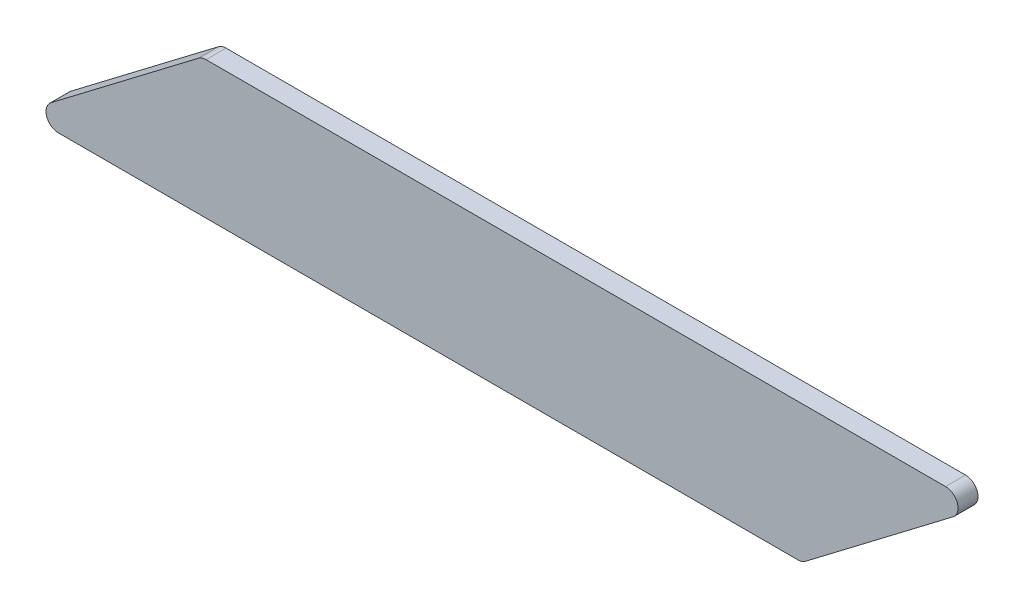
ISO-10303-21;
HEADER;
FILE_DESCRIPTION(('STEP AP214'),'2;1');
FILE_NAME('part.step','',(''),(''),'','','');
FILE_SCHEMA(('AUTOMOTIVE_DESIGN { 1 0 10303 214 1 1 1 1 }'));
ENDSEC;
DATA;
#1=APPLICATION_CONTEXT('core data for automotive mechanical design processes');
#2=APPLICATION_PROTOCOL_DEFINITION('international standard','automotive_design',2000,#1);
#3=PRODUCT_CONTEXT('',#1,'mechanical');
#4=PRODUCT('Part','Part','',(#3));
#5=PRODUCT_RELATED_PRODUCT_CATEGORY('part','',(#4));
#6=PRODUCT_DEFINITION_FORMATION('','',#4);
#7=PRODUCT_DEFINITION_CONTEXT('part definition',#1,'design');
#8=PRODUCT_DEFINITION('design','',#6,#7);
#9=PRODUCT_DEFINITION_SHAPE('','',#8);
#10=(LENGTH_UNIT() NAMED_UNIT(*) SI_UNIT(.MILLI.,.METRE.));
#11=(NAMED_UNIT(*) PLANE_ANGLE_UNIT() SI_UNIT($,.RADIAN.));
#12=(NAMED_UNIT(*) SI_UNIT($,.STERADIAN.) SOLID_ANGLE_UNIT());
#13=UNCERTAINTY_MEASURE_WITH_UNIT(LENGTH_MEASURE(1.E-05),#10,'distance_accuracy_value','');
#14=(GEOMETRIC_REPRESENTATION_CONTEXT(3) GLOBAL_UNCERTAINTY_ASSIGNED_CONTEXT((#13)) GLOBAL_UNIT_ASSIGNED_CONTEXT((#10,
#11,#12)) REPRESENTATION_CONTEXT('',''));
#15=CARTESIAN_POINT('',(0.,0.,0.));
#16=DIRECTION('',(0.,0.,1.));
#17=DIRECTION('',(1.,0.,0.));
#18=AXIS2_PLACEMENT_3D('',#15,#16,#17);
#19=CARTESIAN_POINT('',(-38.5,5.5,1.6));
#20=DIRECTION('',(0.,-1.,0.));
#21=DIRECTION('',(0.,0.,-1.));
#22=AXIS2_PLACEMENT_3D('',#19,#20,#21);
#23=PLANE('',#22);
#24=DIRECTION('',(-1.,0.,0.));
#25=VECTOR('',#24,1.);
#26=CARTESIAN_POINT('',(-38.5,5.5,1.6));
#27=LINE('',#26,#25);
#28=CARTESIAN_POINT('',(35.5346856033122,5.5,1.6));
#29=VERTEX_POINT('',#28);
#30=CARTESIAN_POINT('',(-23.7083164805004,5.5,1.6));
#31=VERTEX_POINT('',#30);
#32=EDGE_CURVE('E156',#29,#31,#27,.T.);
#33=ORIENTED_EDGE('',*,*,#32,.F.);
#34=DIRECTION('',(0.,0.,-1.));
#35=VECTOR('',#34,1.);
#36=CARTESIAN_POINT('',(35.5346856033122,5.5,0.));
#37=LINE('',#36,#35);
#38=CARTESIAN_POINT('',(35.5346856033122,5.5,0.));
#39=VERTEX_POINT('',#38);
#40=EDGE_CURVE('E137',#29,#39,#37,.T.);
#41=ORIENTED_EDGE('',*,*,#40,.T.);
#42=DIRECTION('',(-1.,0.,0.));
#43=VECTOR('',#42,1.);
#44=CARTESIAN_POINT('',(-38.5,5.5,0.));
#45=LINE('',#44,#43);
#46=CARTESIAN_POINT('',(-23.7083164805004,5.5,0.));
#47=VERTEX_POINT('',#46);
#48=EDGE_CURVE('E131',#39,#47,#45,.T.);
#49=ORIENTED_EDGE('',*,*,#48,.T.);
#50=DIRECTION('',(0.,0.,-1.));
#51=VECTOR('',#50,1.);
#52=CARTESIAN_POINT('',(-23.7083164805004,5.5,1.6));
#53=LINE('',#52,#51);
#54=EDGE_CURVE('E142',#47,#31,#53,.F.);
#55=ORIENTED_EDGE('',*,*,#54,.T.);
#56=EDGE_LOOP('',(#33,#41,#49,#55));
#57=FACE_BOUND('',#56,.T.);
#58=ADVANCED_FACE('F43',(#57),#23,.F.);
#59=CARTESIAN_POINT('',(-38.5,-5.5,1.6));
#60=DIRECTION('',(0.,1.,0.));
#61=DIRECTION('',(0.,0.,1.));
#62=AXIS2_PLACEMENT_3D('',#59,#60,#61);
#63=PLANE('',#62);
#64=DIRECTION('',(1.,0.,0.));
#65=VECTOR('',#64,1.);
#66=CARTESIAN_POINT('',(-38.5,-5.5,0.));
#67=LINE('',#66,#65);
#68=CARTESIAN_POINT('',(-35.5346856033122,-5.5,0.));
#69=VERTEX_POINT('',#68);
#70=CARTESIAN_POINT('',(23.7083164805004,-5.5,0.));
#71=VERTEX_POINT('',#70);
#72=EDGE_CURVE('E163',#69,#71,#67,.T.);
#73=ORIENTED_EDGE('',*,*,#72,.T.);
#74=DIRECTION('',(0.,0.,-1.));
#75=VECTOR('',#74,1.);
#76=CARTESIAN_POINT('',(23.7083164805004,-5.5,1.6));
#77=LINE('',#76,#75);
#78=CARTESIAN_POINT('',(23.7083164805004,-5.5,1.6));
#79=VERTEX_POINT('',#78);
#80=EDGE_CURVE('E193',#71,#79,#77,.F.);
#81=ORIENTED_EDGE('',*,*,#80,.T.);
#82=DIRECTION('',(1.,0.,0.));
#83=VECTOR('',#82,1.);
#84=CARTESIAN_POINT('',(-38.5,-5.5,1.6));
#85=LINE('',#84,#83);
#86=CARTESIAN_POINT('',(-35.5346856033122,-5.5,1.6));
#87=VERTEX_POINT('',#86);
#88=EDGE_CURVE('E169',#87,#79,#85,.T.);
#89=ORIENTED_EDGE('',*,*,#88,.F.);
#90=DIRECTION('',(0.,0.,-1.));
#91=VECTOR('',#90,1.);
#92=CARTESIAN_POINT('',(-35.5346856033122,-5.5,0.));
#93=LINE('',#92,#91);
#94=EDGE_CURVE('E189',#87,#69,#93,.T.);
#95=ORIENTED_EDGE('',*,*,#94,.T.);
#96=EDGE_LOOP('',(#73,#81,#89,#95));
#97=FACE_BOUND('',#96,.T.);
#98=ADVANCED_FACE('F201',(#97),#63,.F.);
#99=CARTESIAN_POINT('',(0.,0.,1.6));
#100=DIRECTION('',(0.,0.,-1.));
#101=DIRECTION('',(-1.,0.,0.));
#102=AXIS2_PLACEMENT_3D('',#99,#100,#101);
#103=PLANE('',#102);
#104=ORIENTED_EDGE('',*,*,#88,.T.);
#105=CARTESIAN_POINT('',(23.7083164805004,-4.5,1.6));
#106=DIRECTION('',(0.,0.,-1.));
#107=DIRECTION('',(-1.,0.,0.));
#108=AXIS2_PLACEMENT_3D('',#105,#106,#107);
#109=CIRCLE('',#108,1.);
#110=CARTESIAN_POINT('',(24.3139097216133,-5.29577435640909,1.6));
#111=VERTEX_POINT('',#110);
#112=EDGE_CURVE('E129',#79,#111,#109,.F.);
#113=ORIENTED_EDGE('',*,*,#112,.T.);
#114=DIRECTION('',(-0.795774356409091,-0.605593241112959,0.));
#115=VECTOR('',#114,1.);
#116=CARTESIAN_POINT('',(11.4690765424374,-15.0708369654052,1.6));
#117=LINE('',#116,#115);
#118=CARTESIAN_POINT('',(36.1402788444251,3.70422564359092,1.6));
#119=VERTEX_POINT('',#118);
#120=EDGE_CURVE('E115',#119,#111,#117,.T.);
#121=ORIENTED_EDGE('',*,*,#120,.F.);
#122=CARTESIAN_POINT('',(35.5346856033122,4.5,1.6));
#123=DIRECTION('',(0.,0.,-1.));
#124=DIRECTION('',(-1.,0.,0.));
#125=AXIS2_PLACEMENT_3D('',#122,#123,#124);
#126=CIRCLE('',#125,1.);
#127=EDGE_CURVE('E126',#119,#29,#126,.F.);
#128=ORIENTED_EDGE('',*,*,#127,.T.);
#129=ORIENTED_EDGE('',*,*,#32,.T.);
#130=CARTESIAN_POINT('',(-23.7083164805004,4.5,1.6));
#131=DIRECTION('',(0.,0.,-1.));
#132=DIRECTION('',(-1.,0.,0.));
#133=AXIS2_PLACEMENT_3D('',#130,#131,#132);
#134=CIRCLE('',#133,1.);
#135=CARTESIAN_POINT('',(-24.3139097216133,5.29577435640909,1.6));
#136=VERTEX_POINT('',#135);
#137=EDGE_CURVE('E59',#31,#136,#134,.F.);
#138=ORIENTED_EDGE('',*,*,#137,.T.);
#139=DIRECTION('',(0.795774356409091,0.605593241112958,0.));
#140=VECTOR('',#139,1.);
#141=CARTESIAN_POINT('',(-11.4690765424374,15.0708369654052,1.6));
#142=LINE('',#141,#140);
#143=CARTESIAN_POINT('',(-36.1402788444251,-3.70422564359091,1.6));
#144=VERTEX_POINT('',#143);
#145=EDGE_CURVE('E132',#144,#136,#142,.T.);
#146=ORIENTED_EDGE('',*,*,#145,.F.);
#147=CARTESIAN_POINT('',(-35.5346856033122,-4.5,1.6));
#148=DIRECTION('',(0.,0.,-1.));
#149=DIRECTION('',(-1.,0.,0.));
#150=AXIS2_PLACEMENT_3D('',#147,#148,#149);
#151=CIRCLE('',#150,1.);
#152=EDGE_CURVE('E144',#144,#87,#151,.F.);
#153=ORIENTED_EDGE('',*,*,#152,.T.);
#154=EDGE_LOOP('',(#104,#113,#121,#128,#129,#138,#146,#153));
#155=FACE_BOUND('',#154,.T.);
#156=ADVANCED_FACE('F125',(#155),#103,.F.);
#157=CARTESIAN_POINT('',(0.,0.,0.));
#158=DIRECTION('',(0.,0.,-1.));
#159=DIRECTION('',(-1.,0.,0.));
#160=AXIS2_PLACEMENT_3D('',#157,#158,#159);
#161=PLANE('',#160);
#162=DIRECTION('',(-0.795774356409091,-0.605593241112959,0.));
#163=VECTOR('',#162,1.);
#164=CARTESIAN_POINT('',(11.4690765424374,-15.0708369654052,0.));
#165=LINE('',#164,#163);
#166=CARTESIAN_POINT('',(36.1402788444251,3.70422564359092,0.));
#167=VERTEX_POINT('',#166);
#168=CARTESIAN_POINT('',(24.3139097216133,-5.29577435640909,0.));
#169=VERTEX_POINT('',#168);
#170=EDGE_CURVE('E118',#167,#169,#165,.T.);
#171=ORIENTED_EDGE('',*,*,#170,.T.);
#172=CARTESIAN_POINT('',(23.7083164805004,-4.5,0.));
#173=DIRECTION('',(0.,0.,-1.));
#174=DIRECTION('',(-1.,0.,0.));
#175=AXIS2_PLACEMENT_3D('',#172,#173,#174);
#176=CIRCLE('',#175,1.);
#177=EDGE_CURVE('E186',#169,#71,#176,.T.);
#178=ORIENTED_EDGE('',*,*,#177,.T.);
#179=ORIENTED_EDGE('',*,*,#72,.F.);
#180=CARTESIAN_POINT('',(-35.5346856033122,-4.5,0.));
#181=DIRECTION('',(0.,0.,-1.));
#182=DIRECTION('',(-1.,0.,0.));
#183=AXIS2_PLACEMENT_3D('',#180,#181,#182);
#184=CIRCLE('',#183,1.);
#185=CARTESIAN_POINT('',(-36.1402788444251,-3.70422564359091,0.));
#186=VERTEX_POINT('',#185);
#187=EDGE_CURVE('E179',#69,#186,#184,.T.);
#188=ORIENTED_EDGE('',*,*,#187,.T.);
#189=DIRECTION('',(0.795774356409091,0.605593241112958,0.));
#190=VECTOR('',#189,1.);
#191=CARTESIAN_POINT('',(-11.4690765424374,15.0708369654052,0.));
#192=LINE('',#191,#190);
#193=CARTESIAN_POINT('',(-24.3139097216133,5.29577435640909,0.));
#194=VERTEX_POINT('',#193);
#195=EDGE_CURVE('E172',#186,#194,#192,.T.);
#196=ORIENTED_EDGE('',*,*,#195,.T.);
#197=CARTESIAN_POINT('',(-23.7083164805004,4.5,0.));
#198=DIRECTION('',(0.,0.,-1.));
#199=DIRECTION('',(-1.,0.,0.));
#200=AXIS2_PLACEMENT_3D('',#197,#198,#199);
#201=CIRCLE('',#200,1.);
#202=EDGE_CURVE('E161',#194,#47,#201,.T.);
#203=ORIENTED_EDGE('',*,*,#202,.T.);
#204=ORIENTED_EDGE('',*,*,#48,.F.);
#205=CARTESIAN_POINT('',(35.5346856033122,4.5,0.));
#206=DIRECTION('',(0.,0.,-1.));
#207=DIRECTION('',(-1.,0.,0.));
#208=AXIS2_PLACEMENT_3D('',#205,#206,#207);
#209=CIRCLE('',#208,1.);
#210=EDGE_CURVE('E159',#39,#167,#209,.T.);
#211=ORIENTED_EDGE('',*,*,#210,.T.);
#212=EDGE_LOOP('',(#171,#178,#179,#188,#196,#203,#204,#211));
#213=FACE_BOUND('',#212,.T.);
#214=ADVANCED_FACE('F158',(#213),#161,.T.);
#215=CARTESIAN_POINT('',(-11.4690765424374,15.0708369654052,1.600012));
#216=DIRECTION('',(-0.605593241112958,0.795774356409091,0.));
#217=DIRECTION('',(-0.795774356409091,-0.605593241112958,0.));
#218=AXIS2_PLACEMENT_3D('',#215,#216,#217);
#219=PLANE('',#218);
#220=ORIENTED_EDGE('',*,*,#145,.T.);
#221=DIRECTION('',(0.,0.,-1.));
#222=VECTOR('',#221,1.);
#223=CARTESIAN_POINT('',(-24.3139097216133,5.29577435640909,0.));
#224=LINE('',#223,#222);
#225=EDGE_CURVE('E11',#136,#194,#224,.T.);
#226=ORIENTED_EDGE('',*,*,#225,.T.);
#227=ORIENTED_EDGE('',*,*,#195,.F.);
#228=DIRECTION('',(0.,0.,-1.));
#229=VECTOR('',#228,1.);
#230=CARTESIAN_POINT('',(-36.1402788444251,-3.70422564359091,1.6));
#231=LINE('',#230,#229);
#232=EDGE_CURVE('E52',#186,#144,#231,.F.);
#233=ORIENTED_EDGE('',*,*,#232,.T.);
#234=EDGE_LOOP('',(#220,#226,#227,#233));
#235=FACE_BOUND('',#234,.T.);
#236=ADVANCED_FACE('F205',(#235),#219,.T.);
#237=CARTESIAN_POINT('',(11.4690765424374,-15.0708369654052,1.600012));
#238=DIRECTION('',(0.605593241112959,-0.795774356409091,0.));
#239=DIRECTION('',(0.795774356409091,0.605593241112959,0.));
#240=AXIS2_PLACEMENT_3D('',#237,#238,#239);
#241=PLANE('',#240);
#242=ORIENTED_EDGE('',*,*,#120,.T.);
#243=DIRECTION('',(0.,0.,-1.));
#244=VECTOR('',#243,1.);
#245=CARTESIAN_POINT('',(24.3139097216133,-5.29577435640909,0.));
#246=LINE('',#245,#244);
#247=EDGE_CURVE('E122',#111,#169,#246,.T.);
#248=ORIENTED_EDGE('',*,*,#247,.T.);
#249=ORIENTED_EDGE('',*,*,#170,.F.);
#250=DIRECTION('',(0.,0.,-1.));
#251=VECTOR('',#250,1.);
#252=CARTESIAN_POINT('',(36.1402788444251,3.70422564359091,1.6));
#253=LINE('',#252,#251);
#254=EDGE_CURVE('E111',#167,#119,#253,.F.);
#255=ORIENTED_EDGE('',*,*,#254,.T.);
#256=EDGE_LOOP('',(#242,#248,#249,#255));
#257=FACE_BOUND('',#256,.T.);
#258=ADVANCED_FACE('F113',(#257),#241,.T.);
#259=CARTESIAN_POINT('',(23.7083164805004,-4.5,1.600012));
#260=DIRECTION('',(0.,0.,1.));
#261=DIRECTION('',(1.,0.,0.));
#262=AXIS2_PLACEMENT_3D('',#259,#260,#261);
#263=CYLINDRICAL_SURFACE('',#262,1.);
#264=ORIENTED_EDGE('',*,*,#112,.F.);
#265=ORIENTED_EDGE('',*,*,#80,.F.);
#266=ORIENTED_EDGE('',*,*,#177,.F.);
#267=ORIENTED_EDGE('',*,*,#247,.F.);
#268=EDGE_LOOP('',(#264,#265,#266,#267));
#269=FACE_BOUND('',#268,.T.);
#270=ADVANCED_FACE('F217',(#269),#263,.T.);
#271=CARTESIAN_POINT('',(35.5346856033122,4.5,1.6));
#272=DIRECTION('',(0.,0.,1.));
#273=DIRECTION('',(1.,0.,0.));
#274=AXIS2_PLACEMENT_3D('',#271,#272,#273);
#275=CYLINDRICAL_SURFACE('',#274,1.);
#276=ORIENTED_EDGE('',*,*,#127,.F.);
#277=ORIENTED_EDGE('',*,*,#254,.F.);
#278=ORIENTED_EDGE('',*,*,#210,.F.);
#279=ORIENTED_EDGE('',*,*,#40,.F.);
#280=EDGE_LOOP('',(#276,#277,#278,#279));
#281=FACE_BOUND('',#280,.T.);
#282=ADVANCED_FACE('F135',(#281),#275,.T.);
#283=CARTESIAN_POINT('',(-23.7083164805004,4.5,1.600012));
#284=DIRECTION('',(0.,0.,1.));
#285=DIRECTION('',(1.,0.,0.));
#286=AXIS2_PLACEMENT_3D('',#283,#284,#285);
#287=CYLINDRICAL_SURFACE('',#286,1.);
#288=ORIENTED_EDGE('',*,*,#137,.F.);
#289=ORIENTED_EDGE('',*,*,#54,.F.);
#290=ORIENTED_EDGE('',*,*,#202,.F.);
#291=ORIENTED_EDGE('',*,*,#225,.F.);
#292=EDGE_LOOP('',(#288,#289,#290,#291));
#293=FACE_BOUND('',#292,.T.);
#294=ADVANCED_FACE('F208',(#293),#287,.T.);
#295=CARTESIAN_POINT('',(-35.5346856033122,-4.5,1.6));
#296=DIRECTION('',(0.,0.,1.));
#297=DIRECTION('',(1.,0.,0.));
#298=AXIS2_PLACEMENT_3D('',#295,#296,#297);
#299=CYLINDRICAL_SURFACE('',#298,1.);
#300=ORIENTED_EDGE('',*,*,#152,.F.);
#301=ORIENTED_EDGE('',*,*,#232,.F.);
#302=ORIENTED_EDGE('',*,*,#187,.F.);
#303=ORIENTED_EDGE('',*,*,#94,.F.);
#304=EDGE_LOOP('',(#300,#301,#302,#303));
#305=FACE_BOUND('',#304,.T.);
#306=ADVANCED_FACE('F45',(#305),#299,.T.);
#307=CLOSED_SHELL('',(#58,#98,#156,#214,#236,#258,#270,#282,#294,#306));
#308=MANIFOLD_SOLID_BREP('B2',#307);
#309=ADVANCED_BREP_SHAPE_REPRESENTATION('',(#18,#308),#14);
#310=SHAPE_DEFINITION_REPRESENTATION(#9,#309);
ENDSEC;
END-ISO-10303-21;
